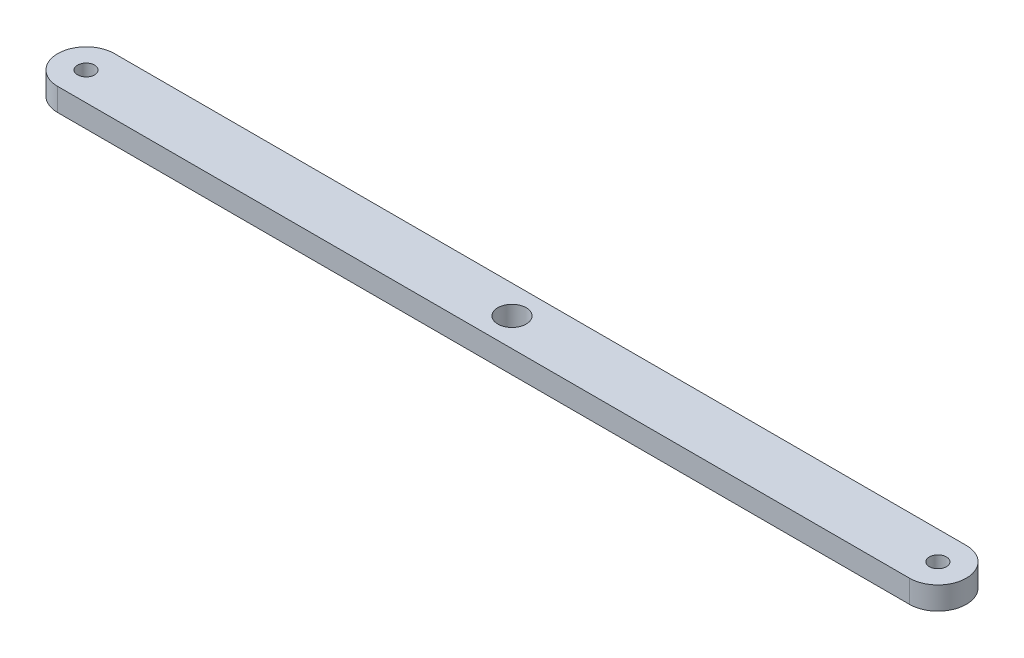
ISO-10303-21;
HEADER;
FILE_DESCRIPTION(('STEP AP214'),'2;1');
FILE_NAME('part.step','',(''),(''),'','','');
FILE_SCHEMA(('AUTOMOTIVE_DESIGN { 1 0 10303 214 1 1 1 1 }'));
ENDSEC;
DATA;
#1=APPLICATION_CONTEXT('core data for automotive mechanical design processes');
#2=APPLICATION_PROTOCOL_DEFINITION('international standard','automotive_design',2000,#1);
#3=PRODUCT_CONTEXT('',#1,'mechanical');
#4=PRODUCT('Part','Part','',(#3));
#5=PRODUCT_RELATED_PRODUCT_CATEGORY('part','',(#4));
#6=PRODUCT_DEFINITION_FORMATION('','',#4);
#7=PRODUCT_DEFINITION_CONTEXT('part definition',#1,'design');
#8=PRODUCT_DEFINITION('design','',#6,#7);
#9=PRODUCT_DEFINITION_SHAPE('','',#8);
#10=(LENGTH_UNIT() NAMED_UNIT(*) SI_UNIT(.MILLI.,.METRE.));
#11=(NAMED_UNIT(*) PLANE_ANGLE_UNIT() SI_UNIT($,.RADIAN.));
#12=(NAMED_UNIT(*) SI_UNIT($,.STERADIAN.) SOLID_ANGLE_UNIT());
#13=UNCERTAINTY_MEASURE_WITH_UNIT(LENGTH_MEASURE(1.E-05),#10,'distance_accuracy_value','');
#14=(GEOMETRIC_REPRESENTATION_CONTEXT(3) GLOBAL_UNCERTAINTY_ASSIGNED_CONTEXT((#13)) GLOBAL_UNIT_ASSIGNED_CONTEXT((#10,
#11,#12)) REPRESENTATION_CONTEXT('',''));
#15=CARTESIAN_POINT('',(0.,0.,0.));
#16=DIRECTION('',(0.,0.,1.));
#17=DIRECTION('',(1.,0.,0.));
#18=AXIS2_PLACEMENT_3D('',#15,#16,#17);
#19=CARTESIAN_POINT('',(75.0000000000003,4.,0.));
#20=DIRECTION('',(0.,-1.,0.));
#21=DIRECTION('',(0.,0.,-1.));
#22=AXIS2_PLACEMENT_3D('',#19,#20,#21);
#23=CYLINDRICAL_SURFACE('',#22,5.00000000000005);
#24=CARTESIAN_POINT('',(75.0000000000003,0.,0.));
#25=DIRECTION('',(0.,1.,0.));
#26=DIRECTION('',(0.,0.,1.));
#27=AXIS2_PLACEMENT_3D('',#24,#25,#26);
#28=CIRCLE('',#27,5.00000000000005);
#29=CARTESIAN_POINT('',(75.0000000000001,0.,-5.00000000000004));
#30=VERTEX_POINT('',#29);
#31=CARTESIAN_POINT('',(75.0000000000001,0.,4.99999999999996));
#32=VERTEX_POINT('',#31);
#33=EDGE_CURVE('E110',#30,#32,#28,.F.);
#34=ORIENTED_EDGE('',*,*,#33,.F.);
#35=DIRECTION('',(0.,-1.,0.));
#36=VECTOR('',#35,1.);
#37=CARTESIAN_POINT('',(75.0000000000001,4.,-5.00000000000004));
#38=LINE('',#37,#36);
#39=CARTESIAN_POINT('',(75.0000000000001,4.,-5.00000000000004));
#40=VERTEX_POINT('',#39);
#41=EDGE_CURVE('E11',#40,#30,#38,.T.);
#42=ORIENTED_EDGE('',*,*,#41,.F.);
#43=CARTESIAN_POINT('',(75.0000000000003,4.,0.));
#44=DIRECTION('',(0.,1.,0.));
#45=DIRECTION('',(0.,0.,1.));
#46=AXIS2_PLACEMENT_3D('',#43,#44,#45);
#47=CIRCLE('',#46,5.00000000000005);
#48=CARTESIAN_POINT('',(75.0000000000001,4.,4.99999999999996));
#49=VERTEX_POINT('',#48);
#50=EDGE_CURVE('E94',#40,#49,#47,.F.);
#51=ORIENTED_EDGE('',*,*,#50,.T.);
#52=DIRECTION('',(0.,-1.,0.));
#53=VECTOR('',#52,1.);
#54=CARTESIAN_POINT('',(75.0000000000001,4.,4.99999999999996));
#55=LINE('',#54,#53);
#56=EDGE_CURVE('E76',#49,#32,#55,.T.);
#57=ORIENTED_EDGE('',*,*,#56,.T.);
#58=EDGE_LOOP('',(#34,#42,#51,#57));
#59=FACE_BOUND('',#58,.T.);
#60=ADVANCED_FACE('F37',(#59),#23,.T.);
#61=CARTESIAN_POINT('',(0.,4.,-5.00000000000001));
#62=DIRECTION('',(0.,0.,-1.));
#63=DIRECTION('',(-1.,0.,0.));
#64=AXIS2_PLACEMENT_3D('',#61,#62,#63);
#65=PLANE('',#64);
#66=DIRECTION('',(1.,0.,0.));
#67=VECTOR('',#66,1.);
#68=CARTESIAN_POINT('',(0.,0.,-5.00000000000001));
#69=LINE('',#68,#67);
#70=CARTESIAN_POINT('',(-74.9999999999999,0.,-4.99999999999998));
#71=VERTEX_POINT('',#70);
#72=EDGE_CURVE('E87',#71,#30,#69,.T.);
#73=ORIENTED_EDGE('',*,*,#72,.F.);
#74=DIRECTION('',(0.,-1.,0.));
#75=VECTOR('',#74,1.);
#76=CARTESIAN_POINT('',(-74.9999999999999,4.,-4.99999999999998));
#77=LINE('',#76,#75);
#78=CARTESIAN_POINT('',(-74.9999999999999,4.,-4.99999999999998));
#79=VERTEX_POINT('',#78);
#80=EDGE_CURVE('E46',#79,#71,#77,.T.);
#81=ORIENTED_EDGE('',*,*,#80,.F.);
#82=DIRECTION('',(1.,0.,0.));
#83=VECTOR('',#82,1.);
#84=CARTESIAN_POINT('',(0.,4.,-5.00000000000001));
#85=LINE('',#84,#83);
#86=EDGE_CURVE('E85',#79,#40,#85,.T.);
#87=ORIENTED_EDGE('',*,*,#86,.T.);
#88=ORIENTED_EDGE('',*,*,#41,.T.);
#89=EDGE_LOOP('',(#73,#81,#87,#88));
#90=FACE_BOUND('',#89,.T.);
#91=ADVANCED_FACE('F84',(#90),#65,.T.);
#92=CARTESIAN_POINT('',(-74.9999999999997,4.,0.));
#93=DIRECTION('',(0.,-1.,0.));
#94=DIRECTION('',(0.,0.,-1.));
#95=AXIS2_PLACEMENT_3D('',#92,#93,#94);
#96=CYLINDRICAL_SURFACE('',#95,5.);
#97=CARTESIAN_POINT('',(-74.9999999999997,0.,0.));
#98=DIRECTION('',(0.,1.,0.));
#99=DIRECTION('',(0.,0.,1.));
#100=AXIS2_PLACEMENT_3D('',#97,#98,#99);
#101=CIRCLE('',#100,5.);
#102=CARTESIAN_POINT('',(-74.9999999999999,0.,5.00000000000002));
#103=VERTEX_POINT('',#102);
#104=EDGE_CURVE('E114',#103,#71,#101,.F.);
#105=ORIENTED_EDGE('',*,*,#104,.F.);
#106=DIRECTION('',(0.,-1.,0.));
#107=VECTOR('',#106,1.);
#108=CARTESIAN_POINT('',(-74.9999999999999,4.,5.00000000000002));
#109=LINE('',#108,#107);
#110=CARTESIAN_POINT('',(-74.9999999999999,4.,5.00000000000002));
#111=VERTEX_POINT('',#110);
#112=EDGE_CURVE('E69',#111,#103,#109,.T.);
#113=ORIENTED_EDGE('',*,*,#112,.F.);
#114=CARTESIAN_POINT('',(-74.9999999999997,4.,0.));
#115=DIRECTION('',(0.,1.,0.));
#116=DIRECTION('',(0.,0.,1.));
#117=AXIS2_PLACEMENT_3D('',#114,#115,#116);
#118=CIRCLE('',#117,5.);
#119=EDGE_CURVE('E93',#111,#79,#118,.F.);
#120=ORIENTED_EDGE('',*,*,#119,.T.);
#121=ORIENTED_EDGE('',*,*,#80,.T.);
#122=EDGE_LOOP('',(#105,#113,#120,#121));
#123=FACE_BOUND('',#122,.T.);
#124=ADVANCED_FACE('F96',(#123),#96,.T.);
#125=CARTESIAN_POINT('',(-74.9999999999997,4.,0.));
#126=DIRECTION('',(0.,-1.,0.));
#127=DIRECTION('',(0.,0.,-1.));
#128=AXIS2_PLACEMENT_3D('',#125,#126,#127);
#129=CYLINDRICAL_SURFACE('',#128,1.5);
#130=CARTESIAN_POINT('',(-74.9999999999997,4.,0.));
#131=DIRECTION('',(0.,1.,0.));
#132=DIRECTION('',(0.,0.,1.));
#133=AXIS2_PLACEMENT_3D('',#130,#131,#132);
#134=CIRCLE('',#133,1.5);
#135=CARTESIAN_POINT('',(-74.9999999999997,4.,1.50000000000002));
#136=VERTEX_POINT('',#135);
#137=EDGE_CURVE('E126',#136,#136,#134,.T.);
#138=ORIENTED_EDGE('',*,*,#137,.T.);
#139=EDGE_LOOP('',(#138));
#140=FACE_BOUND('',#139,.T.);
#141=CARTESIAN_POINT('',(-74.9999999999997,0.,0.));
#142=DIRECTION('',(0.,1.,0.));
#143=DIRECTION('',(0.,0.,1.));
#144=AXIS2_PLACEMENT_3D('',#141,#142,#143);
#145=CIRCLE('',#144,1.5);
#146=CARTESIAN_POINT('',(-74.9999999999997,0.,1.50000000000002));
#147=VERTEX_POINT('',#146);
#148=EDGE_CURVE('E107',#147,#147,#145,.T.);
#149=ORIENTED_EDGE('',*,*,#148,.F.);
#150=EDGE_LOOP('',(#149));
#151=FACE_BOUND('',#150,.T.);
#152=ADVANCED_FACE('F138',(#140,#151),#129,.F.);
#153=CARTESIAN_POINT('',(75.0000000000003,4.,0.));
#154=DIRECTION('',(0.,-1.,0.));
#155=DIRECTION('',(0.,0.,-1.));
#156=AXIS2_PLACEMENT_3D('',#153,#154,#155);
#157=CYLINDRICAL_SURFACE('',#156,1.5);
#158=CARTESIAN_POINT('',(75.0000000000003,4.,0.));
#159=DIRECTION('',(0.,1.,0.));
#160=DIRECTION('',(0.,0.,1.));
#161=AXIS2_PLACEMENT_3D('',#158,#159,#160);
#162=CIRCLE('',#161,1.5);
#163=CARTESIAN_POINT('',(75.0000000000003,4.,1.5));
#164=VERTEX_POINT('',#163);
#165=EDGE_CURVE('E121',#164,#164,#162,.T.);
#166=ORIENTED_EDGE('',*,*,#165,.T.);
#167=EDGE_LOOP('',(#166));
#168=FACE_BOUND('',#167,.T.);
#169=CARTESIAN_POINT('',(75.0000000000003,0.,0.));
#170=DIRECTION('',(0.,1.,0.));
#171=DIRECTION('',(0.,0.,1.));
#172=AXIS2_PLACEMENT_3D('',#169,#170,#171);
#173=CIRCLE('',#172,1.5);
#174=CARTESIAN_POINT('',(75.0000000000003,0.,1.5));
#175=VERTEX_POINT('',#174);
#176=EDGE_CURVE('E104',#175,#175,#173,.T.);
#177=ORIENTED_EDGE('',*,*,#176,.F.);
#178=EDGE_LOOP('',(#177));
#179=FACE_BOUND('',#178,.T.);
#180=ADVANCED_FACE('F140',(#168,#179),#157,.F.);
#181=CARTESIAN_POINT('',(0.,4.,0.));
#182=DIRECTION('',(0.,-1.,0.));
#183=DIRECTION('',(0.,0.,-1.));
#184=AXIS2_PLACEMENT_3D('',#181,#182,#183);
#185=CYLINDRICAL_SURFACE('',#184,2.5);
#186=CARTESIAN_POINT('',(0.,4.,0.));
#187=DIRECTION('',(0.,1.,0.));
#188=DIRECTION('',(0.,0.,1.));
#189=AXIS2_PLACEMENT_3D('',#186,#187,#188);
#190=CIRCLE('',#189,2.5);
#191=CARTESIAN_POINT('',(0.,4.,2.5));
#192=VERTEX_POINT('',#191);
#193=EDGE_CURVE('E118',#192,#192,#190,.T.);
#194=ORIENTED_EDGE('',*,*,#193,.T.);
#195=EDGE_LOOP('',(#194));
#196=FACE_BOUND('',#195,.T.);
#197=CARTESIAN_POINT('',(0.,0.,0.));
#198=DIRECTION('',(0.,1.,0.));
#199=DIRECTION('',(0.,0.,1.));
#200=AXIS2_PLACEMENT_3D('',#197,#198,#199);
#201=CIRCLE('',#200,2.5);
#202=CARTESIAN_POINT('',(0.,0.,2.5));
#203=VERTEX_POINT('',#202);
#204=EDGE_CURVE('E101',#203,#203,#201,.T.);
#205=ORIENTED_EDGE('',*,*,#204,.F.);
#206=EDGE_LOOP('',(#205));
#207=FACE_BOUND('',#206,.T.);
#208=ADVANCED_FACE('F39',(#196,#207),#185,.F.);
#209=CARTESIAN_POINT('',(0.,4.,4.99999999999999));
#210=DIRECTION('',(0.,0.,-1.));
#211=DIRECTION('',(-1.,0.,0.));
#212=AXIS2_PLACEMENT_3D('',#209,#210,#211);
#213=PLANE('',#212);
#214=DIRECTION('',(1.,0.,0.));
#215=VECTOR('',#214,1.);
#216=CARTESIAN_POINT('',(0.,0.,4.99999999999999));
#217=LINE('',#216,#215);
#218=EDGE_CURVE('E116',#103,#32,#217,.T.);
#219=ORIENTED_EDGE('',*,*,#218,.T.);
#220=ORIENTED_EDGE('',*,*,#56,.F.);
#221=DIRECTION('',(1.,0.,0.));
#222=VECTOR('',#221,1.);
#223=CARTESIAN_POINT('',(0.,4.,4.99999999999999));
#224=LINE('',#223,#222);
#225=EDGE_CURVE('E54',#111,#49,#224,.T.);
#226=ORIENTED_EDGE('',*,*,#225,.F.);
#227=ORIENTED_EDGE('',*,*,#112,.T.);
#228=EDGE_LOOP('',(#219,#220,#226,#227));
#229=FACE_BOUND('',#228,.T.);
#230=ADVANCED_FACE('F147',(#229),#213,.F.);
#231=CARTESIAN_POINT('',(0.,4.,0.));
#232=DIRECTION('',(0.,1.,0.));
#233=DIRECTION('',(0.,0.,1.));
#234=AXIS2_PLACEMENT_3D('',#231,#232,#233);
#235=PLANE('',#234);
#236=ORIENTED_EDGE('',*,*,#193,.F.);
#237=EDGE_LOOP('',(#236));
#238=FACE_BOUND('',#237,.T.);
#239=ORIENTED_EDGE('',*,*,#165,.F.);
#240=EDGE_LOOP('',(#239));
#241=FACE_BOUND('',#240,.T.);
#242=ORIENTED_EDGE('',*,*,#137,.F.);
#243=EDGE_LOOP('',(#242));
#244=FACE_BOUND('',#243,.T.);
#245=ORIENTED_EDGE('',*,*,#50,.F.);
#246=ORIENTED_EDGE('',*,*,#86,.F.);
#247=ORIENTED_EDGE('',*,*,#119,.F.);
#248=ORIENTED_EDGE('',*,*,#225,.T.);
#249=EDGE_LOOP('',(#245,#246,#247,#248));
#250=FACE_BOUND('',#249,.T.);
#251=ADVANCED_FACE('F92',(#238,#241,#244,#250),#235,.T.);
#252=CARTESIAN_POINT('',(0.,0.,0.));
#253=DIRECTION('',(0.,1.,0.));
#254=DIRECTION('',(0.,0.,1.));
#255=AXIS2_PLACEMENT_3D('',#252,#253,#254);
#256=PLANE('',#255);
#257=ORIENTED_EDGE('',*,*,#204,.T.);
#258=EDGE_LOOP('',(#257));
#259=FACE_BOUND('',#258,.T.);
#260=ORIENTED_EDGE('',*,*,#176,.T.);
#261=EDGE_LOOP('',(#260));
#262=FACE_BOUND('',#261,.T.);
#263=ORIENTED_EDGE('',*,*,#148,.T.);
#264=EDGE_LOOP('',(#263));
#265=FACE_BOUND('',#264,.T.);
#266=ORIENTED_EDGE('',*,*,#33,.T.);
#267=ORIENTED_EDGE('',*,*,#218,.F.);
#268=ORIENTED_EDGE('',*,*,#104,.T.);
#269=ORIENTED_EDGE('',*,*,#72,.T.);
#270=EDGE_LOOP('',(#266,#267,#268,#269));
#271=FACE_BOUND('',#270,.T.);
#272=ADVANCED_FACE('F152',(#259,#262,#265,#271),#256,.F.);
#273=CLOSED_SHELL('',(#60,#91,#124,#152,#180,#208,#230,#251,#272));
#274=MANIFOLD_SOLID_BREP('B2',#273);
#275=ADVANCED_BREP_SHAPE_REPRESENTATION('',(#18,#274),#14);
#276=SHAPE_DEFINITION_REPRESENTATION(#9,#275);
ENDSEC;
END-ISO-10303-21;
